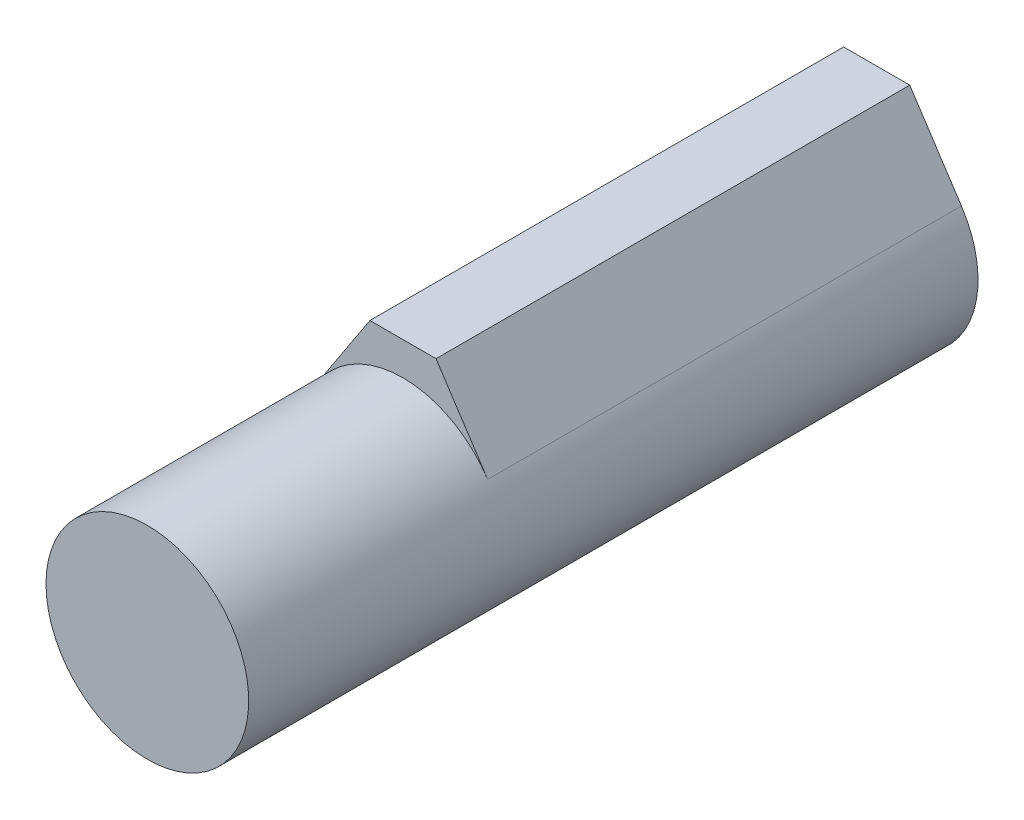
ISO-10303-21;
HEADER;
FILE_DESCRIPTION(('STEP AP214'),'2;1');
FILE_NAME('part.step','',(''),(''),'','','');
FILE_SCHEMA(('AUTOMOTIVE_DESIGN { 1 0 10303 214 1 1 1 1 }'));
ENDSEC;
DATA;
#1=APPLICATION_CONTEXT('core data for automotive mechanical design processes');
#2=APPLICATION_PROTOCOL_DEFINITION('international standard','automotive_design',2000,#1);
#3=PRODUCT_CONTEXT('',#1,'mechanical');
#4=PRODUCT('Part','Part','',(#3));
#5=PRODUCT_RELATED_PRODUCT_CATEGORY('part','',(#4));
#6=PRODUCT_DEFINITION_FORMATION('','',#4);
#7=PRODUCT_DEFINITION_CONTEXT('part definition',#1,'design');
#8=PRODUCT_DEFINITION('design','',#6,#7);
#9=PRODUCT_DEFINITION_SHAPE('','',#8);
#10=(LENGTH_UNIT() NAMED_UNIT(*) SI_UNIT(.MILLI.,.METRE.));
#11=(NAMED_UNIT(*) PLANE_ANGLE_UNIT() SI_UNIT($,.RADIAN.));
#12=(NAMED_UNIT(*) SI_UNIT($,.STERADIAN.) SOLID_ANGLE_UNIT());
#13=UNCERTAINTY_MEASURE_WITH_UNIT(LENGTH_MEASURE(1.E-05),#10,'distance_accuracy_value','');
#14=(GEOMETRIC_REPRESENTATION_CONTEXT(3) GLOBAL_UNCERTAINTY_ASSIGNED_CONTEXT((#13)) GLOBAL_UNIT_ASSIGNED_CONTEXT((#10,
#11,#12)) REPRESENTATION_CONTEXT('',''));
#15=CARTESIAN_POINT('',(0.,0.,0.));
#16=DIRECTION('',(0.,0.,1.));
#17=DIRECTION('',(1.,0.,0.));
#18=AXIS2_PLACEMENT_3D('',#15,#16,#17);
#19=CARTESIAN_POINT('',(-3.,12.2,43.));
#20=DIRECTION('',(0.836160277652638,-0.548485177626401,0.));
#21=DIRECTION('',(0.548485177626401,0.836160277652638,0.));
#22=AXIS2_PLACEMENT_3D('',#19,#20,#21);
#23=PLANE('',#22);
#24=DIRECTION('',(-0.548485177626401,-0.836160277652638,0.));
#25=VECTOR('',#24,1.);
#26=CARTESIAN_POINT('',(-3.,12.2,0.));
#27=LINE('',#26,#25);
#28=CARTESIAN_POINT('',(-3.,12.2,0.));
#29=VERTEX_POINT('',#28);
#30=CARTESIAN_POINT('',(-7.69267455440426,5.04606363416289,0.));
#31=VERTEX_POINT('',#30);
#32=EDGE_CURVE('E95',#29,#31,#27,.T.);
#33=ORIENTED_EDGE('',*,*,#32,.T.);
#34=DIRECTION('',(0.,0.,-1.));
#35=VECTOR('',#34,1.);
#36=CARTESIAN_POINT('',(-7.69267455440426,5.04606363416289,43.));
#37=LINE('',#36,#35);
#38=CARTESIAN_POINT('',(-7.69267455440426,5.04606363416289,43.));
#39=VERTEX_POINT('',#38);
#40=EDGE_CURVE('E11',#39,#31,#37,.T.);
#41=ORIENTED_EDGE('',*,*,#40,.F.);
#42=DIRECTION('',(-0.548485177626401,-0.836160277652638,0.));
#43=VECTOR('',#42,1.);
#44=CARTESIAN_POINT('',(-3.,12.2,43.));
#45=LINE('',#44,#43);
#46=CARTESIAN_POINT('',(-3.,12.2,43.));
#47=VERTEX_POINT('',#46);
#48=EDGE_CURVE('E79',#47,#39,#45,.T.);
#49=ORIENTED_EDGE('',*,*,#48,.F.);
#50=DIRECTION('',(0.,0.,-1.));
#51=VECTOR('',#50,1.);
#52=CARTESIAN_POINT('',(-3.,12.2,43.));
#53=LINE('',#52,#51);
#54=EDGE_CURVE('E104',#47,#29,#53,.T.);
#55=ORIENTED_EDGE('',*,*,#54,.T.);
#56=EDGE_LOOP('',(#33,#41,#49,#55));
#57=FACE_BOUND('',#56,.T.);
#58=ADVANCED_FACE('F36',(#57),#23,.F.);
#59=CARTESIAN_POINT('',(0.,0.,43.));
#60=DIRECTION('',(0.,0.,-1.));
#61=DIRECTION('',(-1.,0.,0.));
#62=AXIS2_PLACEMENT_3D('',#59,#60,#61);
#63=CYLINDRICAL_SURFACE('',#62,9.2);
#64=CARTESIAN_POINT('',(0.,0.,0.));
#65=DIRECTION('',(0.,0.,1.));
#66=DIRECTION('',(1.,0.,0.));
#67=AXIS2_PLACEMENT_3D('',#64,#65,#66);
#68=CIRCLE('',#67,9.2);
#69=CARTESIAN_POINT('',(7.69267455440426,5.04606363416289,0.));
#70=VERTEX_POINT('',#69);
#71=EDGE_CURVE('E93',#31,#70,#68,.T.);
#72=ORIENTED_EDGE('',*,*,#71,.T.);
#73=DIRECTION('',(0.,0.,-1.));
#74=VECTOR('',#73,1.);
#75=CARTESIAN_POINT('',(7.69267455440426,5.04606363416289,43.));
#76=LINE('',#75,#74);
#77=CARTESIAN_POINT('',(7.69267455440426,5.04606363416289,43.));
#78=VERTEX_POINT('',#77);
#79=EDGE_CURVE('E44',#78,#70,#76,.T.);
#80=ORIENTED_EDGE('',*,*,#79,.F.);
#81=CARTESIAN_POINT('',(0.,0.,43.));
#82=DIRECTION('',(0.,0.,1.));
#83=DIRECTION('',(1.,0.,0.));
#84=AXIS2_PLACEMENT_3D('',#81,#82,#83);
#85=CIRCLE('',#84,9.2);
#86=EDGE_CURVE('E92',#78,#39,#85,.T.);
#87=ORIENTED_EDGE('',*,*,#86,.T.);
#88=ORIENTED_EDGE('',*,*,#40,.T.);
#89=EDGE_LOOP('',(#72,#80,#87,#88));
#90=FACE_BOUND('',#89,.T.);
#91=CARTESIAN_POINT('',(0.,0.,66.2));
#92=DIRECTION('',(0.,0.,-1.));
#93=DIRECTION('',(-1.,0.,0.));
#94=AXIS2_PLACEMENT_3D('',#91,#92,#93);
#95=CIRCLE('',#94,9.2);
#96=CARTESIAN_POINT('',(-9.2,0.,66.2));
#97=VERTEX_POINT('',#96);
#98=EDGE_CURVE('E96',#97,#97,#95,.T.);
#99=ORIENTED_EDGE('',*,*,#98,.T.);
#100=EDGE_LOOP('',(#99));
#101=FACE_BOUND('',#100,.T.);
#102=ADVANCED_FACE('F90',(#90,#101),#63,.T.);
#103=CARTESIAN_POINT('',(3.,12.2,43.));
#104=DIRECTION('',(-0.836160277652638,-0.5484851776264,0.));
#105=DIRECTION('',(0.5484851776264,-0.836160277652638,0.));
#106=AXIS2_PLACEMENT_3D('',#103,#104,#105);
#107=PLANE('',#106);
#108=DIRECTION('',(-0.5484851776264,0.836160277652638,0.));
#109=VECTOR('',#108,1.);
#110=CARTESIAN_POINT('',(3.,12.2,0.));
#111=LINE('',#110,#109);
#112=CARTESIAN_POINT('',(3.,12.2,0.));
#113=VERTEX_POINT('',#112);
#114=EDGE_CURVE('E70',#70,#113,#111,.T.);
#115=ORIENTED_EDGE('',*,*,#114,.T.);
#116=DIRECTION('',(0.,0.,-1.));
#117=VECTOR('',#116,1.);
#118=CARTESIAN_POINT('',(3.,12.2,43.));
#119=LINE('',#118,#117);
#120=CARTESIAN_POINT('',(3.,12.2,43.));
#121=VERTEX_POINT('',#120);
#122=EDGE_CURVE('E86',#121,#113,#119,.T.);
#123=ORIENTED_EDGE('',*,*,#122,.F.);
#124=DIRECTION('',(-0.5484851776264,0.836160277652638,0.));
#125=VECTOR('',#124,1.);
#126=CARTESIAN_POINT('',(3.,12.2,43.));
#127=LINE('',#126,#125);
#128=EDGE_CURVE('E83',#78,#121,#127,.T.);
#129=ORIENTED_EDGE('',*,*,#128,.F.);
#130=ORIENTED_EDGE('',*,*,#79,.T.);
#131=EDGE_LOOP('',(#115,#123,#129,#130));
#132=FACE_BOUND('',#131,.T.);
#133=ADVANCED_FACE('F85',(#132),#107,.F.);
#134=CARTESIAN_POINT('',(-3.,12.2,43.));
#135=DIRECTION('',(0.,-1.,0.));
#136=DIRECTION('',(0.,0.,-1.));
#137=AXIS2_PLACEMENT_3D('',#134,#135,#136);
#138=PLANE('',#137);
#139=DIRECTION('',(-1.,0.,0.));
#140=VECTOR('',#139,1.);
#141=CARTESIAN_POINT('',(-3.,12.2,0.));
#142=LINE('',#141,#140);
#143=EDGE_CURVE('E75',#113,#29,#142,.T.);
#144=ORIENTED_EDGE('',*,*,#143,.T.);
#145=ORIENTED_EDGE('',*,*,#54,.F.);
#146=DIRECTION('',(-1.,0.,0.));
#147=VECTOR('',#146,1.);
#148=CARTESIAN_POINT('',(-3.,12.2,43.));
#149=LINE('',#148,#147);
#150=EDGE_CURVE('E52',#121,#47,#149,.T.);
#151=ORIENTED_EDGE('',*,*,#150,.F.);
#152=ORIENTED_EDGE('',*,*,#122,.T.);
#153=EDGE_LOOP('',(#144,#145,#151,#152));
#154=FACE_BOUND('',#153,.T.);
#155=ADVANCED_FACE('F110',(#154),#138,.F.);
#156=CARTESIAN_POINT('',(0.,0.,43.));
#157=DIRECTION('',(0.,0.,1.));
#158=DIRECTION('',(1.,0.,0.));
#159=AXIS2_PLACEMENT_3D('',#156,#157,#158);
#160=PLANE('',#159);
#161=ORIENTED_EDGE('',*,*,#86,.F.);
#162=ORIENTED_EDGE('',*,*,#128,.T.);
#163=ORIENTED_EDGE('',*,*,#150,.T.);
#164=ORIENTED_EDGE('',*,*,#48,.T.);
#165=EDGE_LOOP('',(#161,#162,#163,#164));
#166=FACE_BOUND('',#165,.T.);
#167=ADVANCED_FACE('F94',(#166),#160,.T.);
#168=CARTESIAN_POINT('',(0.,0.,0.));
#169=DIRECTION('',(0.,0.,1.));
#170=DIRECTION('',(1.,0.,0.));
#171=AXIS2_PLACEMENT_3D('',#168,#169,#170);
#172=PLANE('',#171);
#173=ORIENTED_EDGE('',*,*,#114,.F.);
#174=ORIENTED_EDGE('',*,*,#71,.F.);
#175=ORIENTED_EDGE('',*,*,#32,.F.);
#176=ORIENTED_EDGE('',*,*,#143,.F.);
#177=EDGE_LOOP('',(#173,#174,#175,#176));
#178=FACE_BOUND('',#177,.T.);
#179=ADVANCED_FACE('F113',(#178),#172,.F.);
#180=CARTESIAN_POINT('',(0.,0.,66.2));
#181=DIRECTION('',(0.,0.,-1.));
#182=DIRECTION('',(-1.,0.,0.));
#183=AXIS2_PLACEMENT_3D('',#180,#181,#182);
#184=PLANE('',#183);
#185=ORIENTED_EDGE('',*,*,#98,.F.);
#186=EDGE_LOOP('',(#185));
#187=FACE_BOUND('',#186,.T.);
#188=ADVANCED_FACE('F128',(#187),#184,.F.);
#189=CLOSED_SHELL('',(#58,#102,#133,#155,#167,#179,#188));
#190=MANIFOLD_SOLID_BREP('B2',#189);
#191=ADVANCED_BREP_SHAPE_REPRESENTATION('',(#18,#190),#14);
#192=SHAPE_DEFINITION_REPRESENTATION(#9,#191);
ENDSEC;
END-ISO-10303-21;
